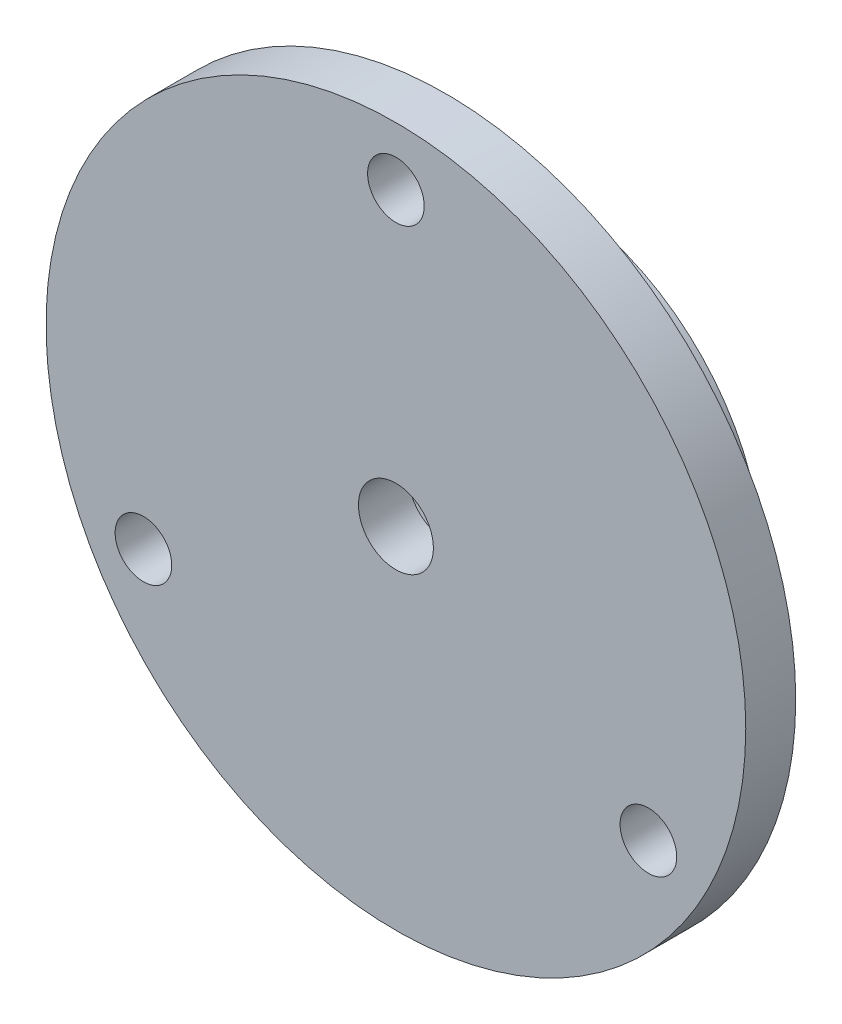
ISO-10303-21;
HEADER;
FILE_DESCRIPTION(('STEP AP214'),'2;1');
FILE_NAME('part.step','',(''),(''),'','','');
FILE_SCHEMA(('AUTOMOTIVE_DESIGN { 1 0 10303 214 1 1 1 1 }'));
ENDSEC;
DATA;
#1=APPLICATION_CONTEXT('core data for automotive mechanical design processes');
#2=APPLICATION_PROTOCOL_DEFINITION('international standard','automotive_design',2000,#1);
#3=PRODUCT_CONTEXT('',#1,'mechanical');
#4=PRODUCT('Part','Part','',(#3));
#5=PRODUCT_RELATED_PRODUCT_CATEGORY('part','',(#4));
#6=PRODUCT_DEFINITION_FORMATION('','',#4);
#7=PRODUCT_DEFINITION_CONTEXT('part definition',#1,'design');
#8=PRODUCT_DEFINITION('design','',#6,#7);
#9=PRODUCT_DEFINITION_SHAPE('','',#8);
#10=(LENGTH_UNIT() NAMED_UNIT(*) SI_UNIT(.MILLI.,.METRE.));
#11=(NAMED_UNIT(*) PLANE_ANGLE_UNIT() SI_UNIT($,.RADIAN.));
#12=(NAMED_UNIT(*) SI_UNIT($,.STERADIAN.) SOLID_ANGLE_UNIT());
#13=UNCERTAINTY_MEASURE_WITH_UNIT(LENGTH_MEASURE(1.E-05),#10,'distance_accuracy_value','');
#14=(GEOMETRIC_REPRESENTATION_CONTEXT(3) GLOBAL_UNCERTAINTY_ASSIGNED_CONTEXT((#13)) GLOBAL_UNIT_ASSIGNED_CONTEXT((#10,
#11,#12)) REPRESENTATION_CONTEXT('',''));
#15=CARTESIAN_POINT('',(0.,0.,0.));
#16=DIRECTION('',(0.,0.,1.));
#17=DIRECTION('',(1.,0.,0.));
#18=AXIS2_PLACEMENT_3D('',#15,#16,#17);
#19=CARTESIAN_POINT('',(-11.7,-3.2,124.2));
#20=DIRECTION('',(0.,0.,1.));
#21=DIRECTION('',(1.,0.,0.));
#22=AXIS2_PLACEMENT_3D('',#19,#20,#21);
#23=PLANE('',#22);
#24=DIRECTION('',(1.,0.,0.));
#25=VECTOR('',#24,1.);
#26=CARTESIAN_POINT('',(-11.7,3.2,124.2));
#27=LINE('',#26,#25);
#28=CARTESIAN_POINT('',(-11.7,3.2,124.2));
#29=VERTEX_POINT('',#28);
#30=CARTESIAN_POINT('',(-9.,3.2,124.2));
#31=VERTEX_POINT('',#30);
#32=EDGE_CURVE('E324',#29,#31,#27,.T.);
#33=ORIENTED_EDGE('',*,*,#32,.T.);
#34=DIRECTION('',(0.,1.,0.));
#35=VECTOR('',#34,1.);
#36=CARTESIAN_POINT('',(-9.,-3.2,124.2));
#37=LINE('',#36,#35);
#38=CARTESIAN_POINT('',(-9.,-3.2,124.2));
#39=VERTEX_POINT('',#38);
#40=EDGE_CURVE('E353',#39,#31,#37,.T.);
#41=ORIENTED_EDGE('',*,*,#40,.F.);
#42=DIRECTION('',(1.,0.,0.));
#43=VECTOR('',#42,1.);
#44=CARTESIAN_POINT('',(-11.7,-3.2,124.2));
#45=LINE('',#44,#43);
#46=CARTESIAN_POINT('',(-11.7,-3.2,124.2));
#47=VERTEX_POINT('',#46);
#48=EDGE_CURVE('E349',#47,#39,#45,.T.);
#49=ORIENTED_EDGE('',*,*,#48,.F.);
#50=DIRECTION('',(0.,1.,0.));
#51=VECTOR('',#50,1.);
#52=CARTESIAN_POINT('',(-11.7,-3.2,124.2));
#53=LINE('',#52,#51);
#54=EDGE_CURVE('E344',#47,#29,#53,.T.);
#55=ORIENTED_EDGE('',*,*,#54,.T.);
#56=EDGE_LOOP('',(#33,#41,#49,#55));
#57=FACE_BOUND('',#56,.T.);
#58=ADVANCED_FACE('F17',(#57),#23,.F.);
#59=CARTESIAN_POINT('',(9.,-3.2,124.2));
#60=DIRECTION('',(0.,0.,1.));
#61=DIRECTION('',(1.,0.,0.));
#62=AXIS2_PLACEMENT_3D('',#59,#60,#61);
#63=PLANE('',#62);
#64=DIRECTION('',(1.,0.,0.));
#65=VECTOR('',#64,1.);
#66=CARTESIAN_POINT('',(9.,3.2,124.2));
#67=LINE('',#66,#65);
#68=CARTESIAN_POINT('',(9.,3.2,124.2));
#69=VERTEX_POINT('',#68);
#70=CARTESIAN_POINT('',(11.7,3.2,124.2));
#71=VERTEX_POINT('',#70);
#72=EDGE_CURVE('E269',#69,#71,#67,.T.);
#73=ORIENTED_EDGE('',*,*,#72,.T.);
#74=DIRECTION('',(0.,1.,0.));
#75=VECTOR('',#74,1.);
#76=CARTESIAN_POINT('',(11.7,-3.2,124.2));
#77=LINE('',#76,#75);
#78=CARTESIAN_POINT('',(11.7,-3.2,124.2));
#79=VERTEX_POINT('',#78);
#80=EDGE_CURVE('E422',#79,#71,#77,.T.);
#81=ORIENTED_EDGE('',*,*,#80,.F.);
#82=DIRECTION('',(1.,0.,0.));
#83=VECTOR('',#82,1.);
#84=CARTESIAN_POINT('',(9.,-3.2,124.2));
#85=LINE('',#84,#83);
#86=CARTESIAN_POINT('',(9.,-3.2,124.2));
#87=VERTEX_POINT('',#86);
#88=EDGE_CURVE('E273',#87,#79,#85,.T.);
#89=ORIENTED_EDGE('',*,*,#88,.F.);
#90=DIRECTION('',(0.,1.,0.));
#91=VECTOR('',#90,1.);
#92=CARTESIAN_POINT('',(9.,-3.2,124.2));
#93=LINE('',#92,#91);
#94=EDGE_CURVE('E45',#87,#69,#93,.T.);
#95=ORIENTED_EDGE('',*,*,#94,.T.);
#96=EDGE_LOOP('',(#73,#81,#89,#95));
#97=FACE_BOUND('',#96,.T.);
#98=ADVANCED_FACE('F677',(#97),#63,.F.);
#99=CARTESIAN_POINT('',(0.,0.,121.));
#100=DIRECTION('',(-1.,0.,0.));
#101=DIRECTION('',(0.,0.,-1.));
#102=AXIS2_PLACEMENT_3D('',#99,#100,#101);
#103=CYLINDRICAL_SURFACE('',#102,1.7);
#104=DIRECTION('',(-1.,0.,0.));
#105=VECTOR('',#104,1.);
#106=CARTESIAN_POINT('',(0.,0.,119.3));
#107=LINE('',#106,#105);
#108=CARTESIAN_POINT('',(-8.2,0.,119.3));
#109=VERTEX_POINT('',#108);
#110=CARTESIAN_POINT('',(-9.,0.,119.3));
#111=VERTEX_POINT('',#110);
#112=EDGE_CURVE('E11',#109,#111,#107,.T.);
#113=ORIENTED_EDGE('',*,*,#112,.F.);
#114=CARTESIAN_POINT('',(-8.2,0.,119.3));
#115=CARTESIAN_POINT('',(-8.2,-0.215049567675,119.3));
#116=CARTESIAN_POINT('',(-8.19342000577,-0.425159052088,119.33173741756));
#117=CARTESIAN_POINT('',(-8.180805876149,-0.624765249664,119.39258934721));
#118=CARTESIAN_POINT('',(-8.163664813006,-0.809082687118,119.47882243838));
#119=CARTESIAN_POINT('',(-8.144154972524,-0.974297761011,119.58561731685));
#120=CARTESIAN_POINT('',(-8.124365167369,-1.11792391323,119.70707430979));
#121=CARTESIAN_POINT('',(-8.085287226445,-1.37352971205,119.97926683929));
#122=CARTESIAN_POINT('',(-8.065762470475,-1.483866681464,120.13534020304));
#123=CARTESIAN_POINT('',(-8.04881135232,-1.570967112417,120.30039462866));
#124=CARTESIAN_POINT('',(-8.035484881398,-1.635638451659,120.47149151375));
#125=CARTESIAN_POINT('',(-8.026395702797,-1.678527139966,120.64635953353));
#126=CARTESIAN_POINT('',(-8.021845174273,-1.7,120.82311151406));
#127=CARTESIAN_POINT('',(-8.021845174273,-1.7,121.17689689779));
#128=CARTESIAN_POINT('',(-8.026396123594,-1.678525133985,121.35364759402));
#129=CARTESIAN_POINT('',(-8.035485309028,-1.635636489501,121.52851080296));
#130=CARTESIAN_POINT('',(-8.048811262946,-1.570967120081,121.69960390039));
#131=CARTESIAN_POINT('',(-8.065762205321,-1.483868247767,121.86465770356));
#132=CARTESIAN_POINT('',(-8.085287123111,-1.373530387951,122.02073244094));
#133=CARTESIAN_POINT('',(-8.12435821755,-1.117969371457,122.29287728211));
#134=CARTESIAN_POINT('',(-8.144149665467,-0.974343035678,122.41435808913));
#135=CARTESIAN_POINT('',(-8.163666864111,-0.809085513769,122.52119388815));
#136=CARTESIAN_POINT('',(-8.180813840138,-0.624705210107,122.60744918929));
#137=CARTESIAN_POINT('',(-8.193425987174,-0.425051885172,122.66829135448));
#138=CARTESIAN_POINT('',(-8.2,-0.214951988363,122.7));
#139=CARTESIAN_POINT('',(-8.2,0.215049567675,122.7));
#140=CARTESIAN_POINT('',(-8.19342000577,0.425159052088,122.66826258243));
#141=CARTESIAN_POINT('',(-8.180805876149,0.624765249663,122.60741065278));
#142=CARTESIAN_POINT('',(-8.163664813006,0.809082687119,122.52117756161));
#143=CARTESIAN_POINT('',(-8.144154972524,0.974297761011,122.41438268314));
#144=CARTESIAN_POINT('',(-8.124365167369,1.11792391323,122.2929256902));
#145=CARTESIAN_POINT('',(-8.085287123814,1.373530383354,122.02073244583));
#146=CARTESIAN_POINT('',(-8.065762203446,1.483868259853,121.86465769266));
#147=CARTESIAN_POINT('',(-8.048811265008,1.570967106626,121.69960390501));
#148=CARTESIAN_POINT('',(-8.03548530799,1.635636496646,121.52851081345));
#149=CARTESIAN_POINT('',(-8.026396123783,1.678525132483,121.35364757984));
#150=CARTESIAN_POINT('',(-8.021845174273,1.7,121.17689690355));
#151=CARTESIAN_POINT('',(-8.021845174273,1.7,120.8231031022));
#152=CARTESIAN_POINT('',(-8.026396123594,1.678525133985,120.64635240597));
#153=CARTESIAN_POINT('',(-8.035485309028,1.635636489502,120.47148919703));
#154=CARTESIAN_POINT('',(-8.048811262946,1.57096712008,120.3003960996));
#155=CARTESIAN_POINT('',(-8.065762205321,1.483868247767,120.13534229643));
#156=CARTESIAN_POINT('',(-8.085287123111,1.373530387951,119.97926755905));
#157=CARTESIAN_POINT('',(-8.124358951378,1.117964571544,119.7071176065));
#158=CARTESIAN_POINT('',(-8.144150850697,0.974334202841,119.58563499163));
#159=CARTESIAN_POINT('',(-8.163667653587,0.809076841195,119.4788027514));
#160=CARTESIAN_POINT('',(-8.180813546129,0.624702938803,119.39255245146));
#161=CARTESIAN_POINT('',(-8.193425309427,0.425058662931,119.33171181383));
#162=CARTESIAN_POINT('',(-8.2,0.214962826234,119.3));
#163=CARTESIAN_POINT('',(-8.2,0.,119.3));
#164=(BOUNDED_CURVE() B_SPLINE_CURVE(7,(#114,#115,#116,#117,#118,#119,#120,#121,#122,#123,#124,
#125,#126,#127,#128,#129,#130,#131,#132,#133,#134,#135,#136,#137,#138,#139,#140,#141,#142,#143,
#144,#145,#146,#147,#148,#149,#150,#151,#152,#153,#154,#155,#156,#157,#158,#159,#160,#161,#162,
#163),.UNSPECIFIED.,.T.,.F.) B_SPLINE_CURVE_WITH_KNOTS((8,6,6,6,6,6,6,6,8),(0.,0.118663257912,
0.25000270751,0.381348402899,0.499972242849,0.618649933116,0.750006013472,0.881362089547,1.),
.UNSPECIFIED.) CURVE() GEOMETRIC_REPRESENTATION_ITEM() RATIONAL_B_SPLINE_CURVE((1.,1.,1.,1.,1.,
1.,1.,1.,1.,1.,1.,1.,1.,1.,1.,1.,1.,1.,1.,1.,1.,1.,1.,1.,1.,1.,1.,1.,1.,1.,1.,1.,1.,1.,1.,1.,1.,
1.,1.,1.,1.,1.,1.,1.,1.,1.,1.,1.,1.,1.)) REPRESENTATION_ITEM(''));
#165=EDGE_CURVE('E410',#109,#109,#164,.T.);
#166=ORIENTED_EDGE('',*,*,#165,.F.);
#167=ORIENTED_EDGE('',*,*,#112,.T.);
#168=CARTESIAN_POINT('',(-9.,0.,121.));
#169=DIRECTION('',(-1.,0.,0.));
#170=DIRECTION('',(0.,0.,-1.));
#171=AXIS2_PLACEMENT_3D('',#168,#169,#170);
#172=CIRCLE('',#171,1.7);
#173=EDGE_CURVE('E365',#111,#111,#172,.T.);
#174=ORIENTED_EDGE('',*,*,#173,.T.);
#175=EDGE_LOOP('',(#113,#166,#167,#174));
#176=FACE_BOUND('',#175,.T.);
#177=ADVANCED_FACE('F668',(#176),#103,.F.);
#178=CARTESIAN_POINT('',(0.,0.,121.));
#179=DIRECTION('',(1.,0.,0.));
#180=DIRECTION('',(0.,0.,1.));
#181=AXIS2_PLACEMENT_3D('',#178,#179,#180);
#182=CYLINDRICAL_SURFACE('',#181,1.7);
#183=DIRECTION('',(1.,0.,0.));
#184=VECTOR('',#183,1.);
#185=CARTESIAN_POINT('',(0.,0.,122.7));
#186=LINE('',#185,#184);
#187=CARTESIAN_POINT('',(8.2,0.,122.7));
#188=VERTEX_POINT('',#187);
#189=CARTESIAN_POINT('',(9.,0.,122.7));
#190=VERTEX_POINT('',#189);
#191=EDGE_CURVE('E25',#188,#190,#186,.T.);
#192=ORIENTED_EDGE('',*,*,#191,.F.);
#193=CARTESIAN_POINT('',(8.2,0.,119.3));
#194=CARTESIAN_POINT('',(8.2,0.215049567675,119.3));
#195=CARTESIAN_POINT('',(8.19342000577,0.425159052088,119.33173741756));
#196=CARTESIAN_POINT('',(8.180805876149,0.624765249664,119.39258934721));
#197=CARTESIAN_POINT('',(8.163664813006,0.809082687119,119.47882243838));
#198=CARTESIAN_POINT('',(8.144154972524,0.974297761011,119.58561731685));
#199=CARTESIAN_POINT('',(8.124365167369,1.11792391323,119.70707430979));
#200=CARTESIAN_POINT('',(8.085287123111,1.373530387951,119.97926755905));
#201=CARTESIAN_POINT('',(8.065762205321,1.483868247767,120.13534229643));
#202=CARTESIAN_POINT('',(8.048811262946,1.570967120081,120.3003960996));
#203=CARTESIAN_POINT('',(8.035485309028,1.635636489501,120.47148919703));
#204=CARTESIAN_POINT('',(8.026396123594,1.678525133985,120.64635240597));
#205=CARTESIAN_POINT('',(8.021845174273,1.7,120.8231031022));
#206=CARTESIAN_POINT('',(8.021845174273,1.7,121.17689689779));
#207=CARTESIAN_POINT('',(8.026396123594,1.678525133985,121.35364759402));
#208=CARTESIAN_POINT('',(8.035485309028,1.635636489501,121.52851080296));
#209=CARTESIAN_POINT('',(8.048811262946,1.570967120081,121.69960390039));
#210=CARTESIAN_POINT('',(8.065762205321,1.483868247766,121.86465770356));
#211=CARTESIAN_POINT('',(8.085287123111,1.373530387951,122.02073244094));
#212=CARTESIAN_POINT('',(8.124358951378,1.117964571544,122.29288239349));
#213=CARTESIAN_POINT('',(8.144150850697,0.974334202841,122.41436500836));
#214=CARTESIAN_POINT('',(8.163667653587,0.809076841196,122.52119724859));
#215=CARTESIAN_POINT('',(8.180813546129,0.624702938803,122.60744754853));
#216=CARTESIAN_POINT('',(8.193425309427,0.425058662931,122.66828818616));
#217=CARTESIAN_POINT('',(8.2,0.214962826234,122.7));
#218=CARTESIAN_POINT('',(8.2,0.,122.7));
#219=(BOUNDED_CURVE() B_SPLINE_CURVE(7,(#193,#194,#195,#196,#197,#198,#199,#200,#201,#202,#203,
#204,#205,#206,#207,#208,#209,#210,#211,#212,#213,#214,#215,#216,#217,#218),.UNSPECIFIED.,.F.,
.F.) B_SPLINE_CURVE_WITH_KNOTS((8,6,6,6,8),(0.,0.237342194584,0.500039769677,0.762737344771,1.),
.UNSPECIFIED.) CURVE() GEOMETRIC_REPRESENTATION_ITEM() RATIONAL_B_SPLINE_CURVE((1.,1.,1.,1.,1.,
1.,1.,1.,1.,1.,1.,1.,1.,1.,1.,1.,1.,1.,1.,1.,1.,1.,1.,1.,1.,1.)) REPRESENTATION_ITEM(''));
#220=CARTESIAN_POINT('',(8.2,0.,119.3));
#221=VERTEX_POINT('',#220);
#222=EDGE_CURVE('E390',#221,#188,#219,.T.);
#223=ORIENTED_EDGE('',*,*,#222,.F.);
#224=CARTESIAN_POINT('',(8.2,0.,122.7));
#225=CARTESIAN_POINT('',(8.2,-0.215049567675,122.7));
#226=CARTESIAN_POINT('',(8.19342000577,-0.425159052088,122.66826258243));
#227=CARTESIAN_POINT('',(8.180805876149,-0.624765249663,122.60741065278));
#228=CARTESIAN_POINT('',(8.163664813006,-0.809082687119,122.52117756161));
#229=CARTESIAN_POINT('',(8.144154972524,-0.974297761011,122.41438268314));
#230=CARTESIAN_POINT('',(8.124365167369,-1.117923913229,122.2929256902));
#231=CARTESIAN_POINT('',(8.085287226445,-1.37352971205,122.0207331607));
#232=CARTESIAN_POINT('',(8.065762470475,-1.483866681464,121.86465979695));
#233=CARTESIAN_POINT('',(8.04881135232,-1.570967112417,121.69960537133));
#234=CARTESIAN_POINT('',(8.035484881398,-1.635638451659,121.52850848624));
#235=CARTESIAN_POINT('',(8.026395702797,-1.678527139966,121.35364046646));
#236=CARTESIAN_POINT('',(8.021845174273,-1.7,121.17688848593));
#237=CARTESIAN_POINT('',(8.021845174273,-1.7,120.8231031022));
#238=CARTESIAN_POINT('',(8.026396123594,-1.678525133985,120.64635240597));
#239=CARTESIAN_POINT('',(8.035485309028,-1.635636489501,120.47148919703));
#240=CARTESIAN_POINT('',(8.048811262946,-1.570967120081,120.3003960996));
#241=CARTESIAN_POINT('',(8.065762205321,-1.483868247766,120.13534229643));
#242=CARTESIAN_POINT('',(8.085287123111,-1.373530387951,119.97926755905));
#243=CARTESIAN_POINT('',(8.12435821755,-1.117969371457,119.70712271789));
#244=CARTESIAN_POINT('',(8.144149665467,-0.974343035678,119.58564191086));
#245=CARTESIAN_POINT('',(8.163666864111,-0.809085513768,119.47880611184));
#246=CARTESIAN_POINT('',(8.180813840138,-0.624705210107,119.3925508107));
#247=CARTESIAN_POINT('',(8.193425987174,-0.425051885172,119.33170864551));
#248=CARTESIAN_POINT('',(8.2,-0.214951988363,119.3));
#249=CARTESIAN_POINT('',(8.2,0.,119.3));
#250=(BOUNDED_CURVE() B_SPLINE_CURVE(7,(#224,#225,#226,#227,#228,#229,#230,#231,#232,#233,#234,
#235,#236,#237,#238,#239,#240,#241,#242,#243,#244,#245,#246,#247,#248,#249),.UNSPECIFIED.,.F.,
.F.) B_SPLINE_CURVE_WITH_KNOTS((8,6,6,6,8),(0.,0.237339691572,0.500033174013,0.762739148729,1.),
.UNSPECIFIED.) CURVE() GEOMETRIC_REPRESENTATION_ITEM() RATIONAL_B_SPLINE_CURVE((1.,1.,1.,1.,1.,
1.,1.,1.,1.,1.,1.,1.,1.,1.,1.,1.,1.,1.,1.,1.,1.,1.,1.,1.,1.,1.)) REPRESENTATION_ITEM(''));
#251=EDGE_CURVE('E405',#188,#221,#250,.T.);
#252=ORIENTED_EDGE('',*,*,#251,.F.);
#253=ORIENTED_EDGE('',*,*,#191,.T.);
#254=CARTESIAN_POINT('',(9.,0.,121.));
#255=DIRECTION('',(1.,0.,0.));
#256=DIRECTION('',(0.,0.,1.));
#257=AXIS2_PLACEMENT_3D('',#254,#255,#256);
#258=CIRCLE('',#257,1.7);
#259=EDGE_CURVE('E252',#190,#190,#258,.T.);
#260=ORIENTED_EDGE('',*,*,#259,.T.);
#261=EDGE_LOOP('',(#192,#223,#252,#253,#260));
#262=FACE_BOUND('',#261,.T.);
#263=ADVANCED_FACE('F658',(#262),#182,.F.);
#264=CARTESIAN_POINT('',(9.,-3.2,117.9));
#265=DIRECTION('',(1.,0.,0.));
#266=DIRECTION('',(0.,1.,0.));
#267=AXIS2_PLACEMENT_3D('',#264,#265,#266);
#268=PLANE('',#267);
#269=ORIENTED_EDGE('',*,*,#259,.F.);
#270=EDGE_LOOP('',(#269));
#271=FACE_BOUND('',#270,.T.);
#272=DIRECTION('',(0.,0.,1.));
#273=VECTOR('',#272,1.);
#274=CARTESIAN_POINT('',(9.,-3.2,117.9));
#275=LINE('',#274,#273);
#276=CARTESIAN_POINT('',(9.,-3.2,118.));
#277=VERTEX_POINT('',#276);
#278=EDGE_CURVE('E292',#277,#87,#275,.T.);
#279=ORIENTED_EDGE('',*,*,#278,.F.);
#280=DIRECTION('',(0.,1.,0.));
#281=VECTOR('',#280,1.);
#282=CARTESIAN_POINT('',(9.,-1.6,118.));
#283=LINE('',#282,#281);
#284=CARTESIAN_POINT('',(9.,3.2,118.));
#285=VERTEX_POINT('',#284);
#286=EDGE_CURVE('E364',#277,#285,#283,.T.);
#287=ORIENTED_EDGE('',*,*,#286,.T.);
#288=DIRECTION('',(0.,0.,1.));
#289=VECTOR('',#288,1.);
#290=CARTESIAN_POINT('',(9.,3.2,117.9));
#291=LINE('',#290,#289);
#292=EDGE_CURVE('E272',#285,#69,#291,.T.);
#293=ORIENTED_EDGE('',*,*,#292,.T.);
#294=ORIENTED_EDGE('',*,*,#94,.F.);
#295=EDGE_LOOP('',(#279,#287,#293,#294));
#296=FACE_BOUND('',#295,.T.);
#297=ADVANCED_FACE('F648',(#271,#296),#268,.T.);
#298=CARTESIAN_POINT('',(9.,3.2,117.9));
#299=DIRECTION('',(0.,1.,0.));
#300=DIRECTION('',(1.,0.,0.));
#301=AXIS2_PLACEMENT_3D('',#298,#299,#300);
#302=PLANE('',#301);
#303=ORIENTED_EDGE('',*,*,#72,.F.);
#304=ORIENTED_EDGE('',*,*,#292,.F.);
#305=DIRECTION('',(-1.,0.,0.));
#306=VECTOR('',#305,1.);
#307=CARTESIAN_POINT('',(4.5,3.2,118.));
#308=LINE('',#307,#306);
#309=CARTESIAN_POINT('',(11.7,3.2,118.));
#310=VERTEX_POINT('',#309);
#311=EDGE_CURVE('E259',#310,#285,#308,.T.);
#312=ORIENTED_EDGE('',*,*,#311,.F.);
#313=DIRECTION('',(0.,0.,1.));
#314=VECTOR('',#313,1.);
#315=CARTESIAN_POINT('',(11.7,3.2,117.9));
#316=LINE('',#315,#314);
#317=EDGE_CURVE('E429',#310,#71,#316,.T.);
#318=ORIENTED_EDGE('',*,*,#317,.T.);
#319=EDGE_LOOP('',(#303,#304,#312,#318));
#320=FACE_BOUND('',#319,.T.);
#321=ADVANCED_FACE('F489',(#320),#302,.F.);
#322=CARTESIAN_POINT('',(9.,-3.2,117.9));
#323=DIRECTION('',(0.,1.,0.));
#324=DIRECTION('',(1.,0.,0.));
#325=AXIS2_PLACEMENT_3D('',#322,#323,#324);
#326=PLANE('',#325);
#327=DIRECTION('',(0.,0.,1.));
#328=VECTOR('',#327,1.);
#329=CARTESIAN_POINT('',(11.7,-3.2,117.9));
#330=LINE('',#329,#328);
#331=CARTESIAN_POINT('',(11.7,-3.2,118.));
#332=VERTEX_POINT('',#331);
#333=EDGE_CURVE('E433',#332,#79,#330,.T.);
#334=ORIENTED_EDGE('',*,*,#333,.F.);
#335=DIRECTION('',(-1.,0.,0.));
#336=VECTOR('',#335,1.);
#337=CARTESIAN_POINT('',(4.5,-3.2,118.));
#338=LINE('',#337,#336);
#339=EDGE_CURVE('E373',#332,#277,#338,.T.);
#340=ORIENTED_EDGE('',*,*,#339,.T.);
#341=ORIENTED_EDGE('',*,*,#278,.T.);
#342=ORIENTED_EDGE('',*,*,#88,.T.);
#343=EDGE_LOOP('',(#334,#340,#341,#342));
#344=FACE_BOUND('',#343,.T.);
#345=ADVANCED_FACE('F483',(#344),#326,.T.);
#346=CARTESIAN_POINT('',(-11.7,3.2,117.9));
#347=DIRECTION('',(0.,1.,0.));
#348=DIRECTION('',(1.,0.,0.));
#349=AXIS2_PLACEMENT_3D('',#346,#347,#348);
#350=PLANE('',#349);
#351=ORIENTED_EDGE('',*,*,#32,.F.);
#352=DIRECTION('',(0.,0.,1.));
#353=VECTOR('',#352,1.);
#354=CARTESIAN_POINT('',(-11.7,3.2,117.9));
#355=LINE('',#354,#353);
#356=CARTESIAN_POINT('',(-11.7,3.2,118.));
#357=VERTEX_POINT('',#356);
#358=EDGE_CURVE('E348',#357,#29,#355,.T.);
#359=ORIENTED_EDGE('',*,*,#358,.F.);
#360=DIRECTION('',(-1.,0.,0.));
#361=VECTOR('',#360,1.);
#362=CARTESIAN_POINT('',(-5.85,3.2,118.));
#363=LINE('',#362,#361);
#364=CARTESIAN_POINT('',(-9.,3.2,118.));
#365=VERTEX_POINT('',#364);
#366=EDGE_CURVE('E335',#365,#357,#363,.T.);
#367=ORIENTED_EDGE('',*,*,#366,.F.);
#368=DIRECTION('',(0.,0.,1.));
#369=VECTOR('',#368,1.);
#370=CARTESIAN_POINT('',(-9.,3.2,117.9));
#371=LINE('',#370,#369);
#372=EDGE_CURVE('E369',#365,#31,#371,.T.);
#373=ORIENTED_EDGE('',*,*,#372,.T.);
#374=EDGE_LOOP('',(#351,#359,#367,#373));
#375=FACE_BOUND('',#374,.T.);
#376=ADVANCED_FACE('F488',(#375),#350,.F.);
#377=CARTESIAN_POINT('',(-11.7,-3.2,117.9));
#378=DIRECTION('',(1.,0.,0.));
#379=DIRECTION('',(0.,1.,0.));
#380=AXIS2_PLACEMENT_3D('',#377,#378,#379);
#381=PLANE('',#380);
#382=CARTESIAN_POINT('',(-11.7,0.,121.));
#383=DIRECTION('',(-1.,0.,0.));
#384=DIRECTION('',(0.,0.,-1.));
#385=AXIS2_PLACEMENT_3D('',#382,#383,#384);
#386=CIRCLE('',#385,1.7);
#387=CARTESIAN_POINT('',(-11.7,0.,119.3));
#388=VERTEX_POINT('',#387);
#389=EDGE_CURVE('E377',#388,#388,#386,.T.);
#390=ORIENTED_EDGE('',*,*,#389,.T.);
#391=EDGE_LOOP('',(#390));
#392=FACE_BOUND('',#391,.T.);
#393=DIRECTION('',(0.,0.,1.));
#394=VECTOR('',#393,1.);
#395=CARTESIAN_POINT('',(-11.7,-3.2,117.9));
#396=LINE('',#395,#394);
#397=CARTESIAN_POINT('',(-11.7,-3.2,118.));
#398=VERTEX_POINT('',#397);
#399=EDGE_CURVE('E354',#398,#47,#396,.T.);
#400=ORIENTED_EDGE('',*,*,#399,.F.);
#401=DIRECTION('',(0.,1.,0.));
#402=VECTOR('',#401,1.);
#403=CARTESIAN_POINT('',(-11.7,-1.6,118.));
#404=LINE('',#403,#402);
#405=EDGE_CURVE('E339',#398,#357,#404,.T.);
#406=ORIENTED_EDGE('',*,*,#405,.T.);
#407=ORIENTED_EDGE('',*,*,#358,.T.);
#408=ORIENTED_EDGE('',*,*,#54,.F.);
#409=EDGE_LOOP('',(#400,#406,#407,#408));
#410=FACE_BOUND('',#409,.T.);
#411=ADVANCED_FACE('F622',(#392,#410),#381,.T.);
#412=CARTESIAN_POINT('',(-9.,-3.2,117.9));
#413=DIRECTION('',(1.,0.,0.));
#414=DIRECTION('',(0.,1.,0.));
#415=AXIS2_PLACEMENT_3D('',#412,#413,#414);
#416=PLANE('',#415);
#417=ORIENTED_EDGE('',*,*,#173,.F.);
#418=EDGE_LOOP('',(#417));
#419=FACE_BOUND('',#418,.T.);
#420=ORIENTED_EDGE('',*,*,#40,.T.);
#421=ORIENTED_EDGE('',*,*,#372,.F.);
#422=DIRECTION('',(0.,1.,0.));
#423=VECTOR('',#422,1.);
#424=CARTESIAN_POINT('',(-9.,-1.6,118.));
#425=LINE('',#424,#423);
#426=CARTESIAN_POINT('',(-9.,-3.2,118.));
#427=VERTEX_POINT('',#426);
#428=EDGE_CURVE('E331',#427,#365,#425,.T.);
#429=ORIENTED_EDGE('',*,*,#428,.F.);
#430=DIRECTION('',(0.,0.,1.));
#431=VECTOR('',#430,1.);
#432=CARTESIAN_POINT('',(-9.,-3.2,117.9));
#433=LINE('',#432,#431);
#434=EDGE_CURVE('E437',#427,#39,#433,.T.);
#435=ORIENTED_EDGE('',*,*,#434,.T.);
#436=EDGE_LOOP('',(#420,#421,#429,#435));
#437=FACE_BOUND('',#436,.T.);
#438=ADVANCED_FACE('F519',(#419,#437),#416,.F.);
#439=CARTESIAN_POINT('',(-11.7,-3.2,117.9));
#440=DIRECTION('',(0.,1.,0.));
#441=DIRECTION('',(1.,0.,0.));
#442=AXIS2_PLACEMENT_3D('',#439,#440,#441);
#443=PLANE('',#442);
#444=ORIENTED_EDGE('',*,*,#434,.F.);
#445=DIRECTION('',(-1.,0.,0.));
#446=VECTOR('',#445,1.);
#447=CARTESIAN_POINT('',(-5.85,-3.2,118.));
#448=LINE('',#447,#446);
#449=EDGE_CURVE('E343',#427,#398,#448,.T.);
#450=ORIENTED_EDGE('',*,*,#449,.T.);
#451=ORIENTED_EDGE('',*,*,#399,.T.);
#452=ORIENTED_EDGE('',*,*,#48,.T.);
#453=EDGE_LOOP('',(#444,#450,#451,#452));
#454=FACE_BOUND('',#453,.T.);
#455=ADVANCED_FACE('F513',(#454),#443,.T.);
#456=CARTESIAN_POINT('',(11.7,-3.2,117.9));
#457=DIRECTION('',(1.,0.,0.));
#458=DIRECTION('',(0.,1.,0.));
#459=AXIS2_PLACEMENT_3D('',#456,#457,#458);
#460=PLANE('',#459);
#461=CARTESIAN_POINT('',(11.7,0.,121.));
#462=DIRECTION('',(1.,0.,0.));
#463=DIRECTION('',(0.,0.,1.));
#464=AXIS2_PLACEMENT_3D('',#461,#462,#463);
#465=CIRCLE('',#464,1.7);
#466=CARTESIAN_POINT('',(11.7,0.,122.7));
#467=VERTEX_POINT('',#466);
#468=EDGE_CURVE('E320',#467,#467,#465,.T.);
#469=ORIENTED_EDGE('',*,*,#468,.T.);
#470=EDGE_LOOP('',(#469));
#471=FACE_BOUND('',#470,.T.);
#472=ORIENTED_EDGE('',*,*,#80,.T.);
#473=ORIENTED_EDGE('',*,*,#317,.F.);
#474=DIRECTION('',(0.,1.,0.));
#475=VECTOR('',#474,1.);
#476=CARTESIAN_POINT('',(11.7,-1.6,118.));
#477=LINE('',#476,#475);
#478=EDGE_CURVE('E255',#332,#310,#477,.T.);
#479=ORIENTED_EDGE('',*,*,#478,.F.);
#480=ORIENTED_EDGE('',*,*,#333,.T.);
#481=EDGE_LOOP('',(#472,#473,#479,#480));
#482=FACE_BOUND('',#481,.T.);
#483=ADVANCED_FACE('F518',(#471,#482),#460,.F.);
#484=CARTESIAN_POINT('',(0.,0.,118.));
#485=DIRECTION('',(0.,0.,1.));
#486=DIRECTION('',(1.,0.,0.));
#487=AXIS2_PLACEMENT_3D('',#484,#485,#486);
#488=CYLINDRICAL_SURFACE('',#487,8.2);
#489=ORIENTED_EDGE('',*,*,#165,.T.);
#490=EDGE_LOOP('',(#489));
#491=FACE_BOUND('',#490,.T.);
#492=DIRECTION('',(0.,0.,1.));
#493=VECTOR('',#492,1.);
#494=CARTESIAN_POINT('',(8.2,0.,118.));
#495=LINE('',#494,#493);
#496=CARTESIAN_POINT('',(8.2,0.,118.));
#497=VERTEX_POINT('',#496);
#498=EDGE_CURVE('E386',#497,#221,#495,.T.);
#499=ORIENTED_EDGE('',*,*,#498,.F.);
#500=CARTESIAN_POINT('',(0.,0.,118.));
#501=DIRECTION('',(0.,0.,1.));
#502=DIRECTION('',(1.,0.,0.));
#503=AXIS2_PLACEMENT_3D('',#500,#501,#502);
#504=CIRCLE('',#503,8.2);
#505=EDGE_CURVE('E260',#497,#497,#504,.T.);
#506=ORIENTED_EDGE('',*,*,#505,.F.);
#507=ORIENTED_EDGE('',*,*,#498,.T.);
#508=ORIENTED_EDGE('',*,*,#222,.T.);
#509=DIRECTION('',(0.,0.,1.));
#510=VECTOR('',#509,1.);
#511=CARTESIAN_POINT('',(8.2,0.,118.));
#512=LINE('',#511,#510);
#513=CARTESIAN_POINT('',(8.2,0.,124.));
#514=VERTEX_POINT('',#513);
#515=EDGE_CURVE('E396',#188,#514,#512,.T.);
#516=ORIENTED_EDGE('',*,*,#515,.T.);
#517=CARTESIAN_POINT('',(0.,0.,124.));
#518=DIRECTION('',(0.,0.,1.));
#519=DIRECTION('',(1.,0.,0.));
#520=AXIS2_PLACEMENT_3D('',#517,#518,#519);
#521=CIRCLE('',#520,8.2);
#522=EDGE_CURVE('E313',#514,#514,#521,.T.);
#523=ORIENTED_EDGE('',*,*,#522,.T.);
#524=ORIENTED_EDGE('',*,*,#515,.F.);
#525=ORIENTED_EDGE('',*,*,#251,.T.);
#526=EDGE_LOOP('',(#499,#506,#507,#508,#516,#523,#524,#525));
#527=FACE_BOUND('',#526,.T.);
#528=ADVANCED_FACE('F557',(#491,#527),#488,.F.);
#529=CARTESIAN_POINT('',(0.,0.,121.));
#530=DIRECTION('',(-1.,0.,0.));
#531=DIRECTION('',(0.,0.,-1.));
#532=AXIS2_PLACEMENT_3D('',#529,#530,#531);
#533=CYLINDRICAL_SURFACE('',#532,1.7);
#534=ORIENTED_EDGE('',*,*,#389,.F.);
#535=DIRECTION('',(-1.,0.,0.));
#536=VECTOR('',#535,1.);
#537=CARTESIAN_POINT('',(0.,0.,119.3));
#538=LINE('',#537,#536);
#539=CARTESIAN_POINT('',(-13.,0.,119.3));
#540=VERTEX_POINT('',#539);
#541=EDGE_CURVE('E383',#388,#540,#538,.T.);
#542=ORIENTED_EDGE('',*,*,#541,.T.);
#543=CARTESIAN_POINT('',(-13.,0.,119.3));
#544=CARTESIAN_POINT('',(-13.,-0.224103629449,119.3));
#545=CARTESIAN_POINT('',(-12.99549275468,-0.442789022544,119.33446610057));
#546=CARTESIAN_POINT('',(-12.98687134126,-0.649799316419,119.40040035514));
#547=CARTESIAN_POINT('',(-12.97525605399,-0.839828402853,119.49353374006));
#548=CARTESIAN_POINT('',(-12.96223136851,-1.008753052545,119.60838750048));
#549=CARTESIAN_POINT('',(-12.94924809956,-1.154034109881,119.73834678735));
#550=CARTESIAN_POINT('',(-12.92508396124,-1.399189065451,120.01642050051));
#551=CARTESIAN_POINT('',(-12.91365232029,-1.500963221601,120.16834585257));
#552=CARTESIAN_POINT('',(-12.90383838395,-1.58123194231,120.32799584137));
#553=CARTESIAN_POINT('',(-12.89617808196,-1.640780500266,120.49279987346));
#554=CARTESIAN_POINT('',(-12.89097228887,-1.68024700538,120.66078608316));
#555=CARTESIAN_POINT('',(-12.88836684766,-1.7,120.83034346275));
#556=CARTESIAN_POINT('',(-12.88836684766,-1.7,121.16966285561));
#557=CARTESIAN_POINT('',(-12.890972477,-1.680245562312,121.33921887524));
#558=CARTESIAN_POINT('',(-12.89617825391,-1.640779241953,121.50720074066));
#559=CARTESIAN_POINT('',(-12.90383826114,-1.581232598169,121.6720009562));
#560=CARTESIAN_POINT('',(-12.91365201798,-1.500965777864,121.83164988873));
#561=CARTESIAN_POINT('',(-12.9250837383,-1.399191327267,121.98357693395));
#562=CARTESIAN_POINT('',(-12.94924333682,-1.15408242977,122.26159840449));
#563=CARTESIAN_POINT('',(-12.96222755883,-1.008802489091,122.3915842386));
#564=CARTESIAN_POINT('',(-12.97525737315,-0.83983232772,122.50648469976));
#565=CARTESIAN_POINT('',(-12.98687712171,-0.649733825668,122.59964393151));
#566=CARTESIAN_POINT('',(-12.99549711041,-0.442670474442,122.66556715007));
#567=CARTESIAN_POINT('',(-13.,-0.223995428021,122.7));
#568=CARTESIAN_POINT('',(-13.,0.224103629449,122.7));
#569=CARTESIAN_POINT('',(-12.99549275468,0.442789022544,122.66553389942));
#570=CARTESIAN_POINT('',(-12.98687134126,0.64979931642,122.59959964485));
#571=CARTESIAN_POINT('',(-12.97525605399,0.839828402852,122.50646625993));
#572=CARTESIAN_POINT('',(-12.96223136851,1.008753052545,122.39161249951));
#573=CARTESIAN_POINT('',(-12.94924809956,1.154034109881,122.26165321264));
#574=CARTESIAN_POINT('',(-12.9250837383,1.399191327267,121.98357693395));
#575=CARTESIAN_POINT('',(-12.91365201798,1.500965777864,121.83164988873));
#576=CARTESIAN_POINT('',(-12.90383826114,1.58123259817,121.6720009562));
#577=CARTESIAN_POINT('',(-12.89617825391,1.640779241953,121.50720074067));
#578=CARTESIAN_POINT('',(-12.890972477,1.680245562312,121.33921887524));
#579=CARTESIAN_POINT('',(-12.88836684766,1.7,121.16966285561));
#580=CARTESIAN_POINT('',(-12.88836684766,1.7,120.83033714438));
#581=CARTESIAN_POINT('',(-12.890972477,1.680245562312,120.66078112475));
#582=CARTESIAN_POINT('',(-12.89617825391,1.640779241953,120.49279925933));
#583=CARTESIAN_POINT('',(-12.90383826114,1.58123259817,120.32799904379));
#584=CARTESIAN_POINT('',(-12.91365201798,1.500965777864,120.16835011126));
#585=CARTESIAN_POINT('',(-12.9250837383,1.399191327267,120.01642306604));
#586=CARTESIAN_POINT('',(-12.94924381395,1.154077589096,119.73839610484));
#587=CARTESIAN_POINT('',(-12.96222832865,1.008793604947,119.60840846593));
#588=CARTESIAN_POINT('',(-12.97525787918,0.839823888834,119.49351212929));
#589=CARTESIAN_POINT('',(-12.98687682519,0.649732618766,119.4003585362));
#590=CARTESIAN_POINT('',(-12.99549658253,0.442679411078,119.33443680822));
#591=CARTESIAN_POINT('',(-13.,0.224008392086,119.3));
#592=CARTESIAN_POINT('',(-13.,0.,119.3));
#593=(BOUNDED_CURVE() B_SPLINE_CURVE(7,(#543,#544,#545,#546,#547,#548,#549,#550,#551,#552,#553,
#554,#555,#556,#557,#558,#559,#560,#561,#562,#563,#564,#565,#566,#567,#568,#569,#570,#571,#572,
#573,#574,#575,#576,#577,#578,#579,#580,#581,#582,#583,#584,#585,#586,#587,#588,#589,#590,#591,
#592),.UNSPECIFIED.,.T.,.F.) B_SPLINE_CURVE_WITH_KNOTS((8,6,6,6,6,6,6,6,8),(0.,0.123552872121,
0.250007608065,0.376467053447,0.499972995958,0.623538598255,0.750008670189,0.876478742124,1.),
.UNSPECIFIED.) CURVE() GEOMETRIC_REPRESENTATION_ITEM() RATIONAL_B_SPLINE_CURVE((1.,1.,1.,1.,1.,
1.,1.,1.,1.,1.,1.,1.,1.,1.,1.,1.,1.,1.,1.,1.,1.,1.,1.,1.,1.,1.,1.,1.,1.,1.,1.,1.,1.,1.,1.,1.,1.,
1.,1.,1.,1.,1.,1.,1.,1.,1.,1.,1.,1.,1.)) REPRESENTATION_ITEM(''));
#594=EDGE_CURVE('E307',#540,#540,#593,.T.);
#595=ORIENTED_EDGE('',*,*,#594,.T.);
#596=ORIENTED_EDGE('',*,*,#541,.F.);
#597=EDGE_LOOP('',(#534,#542,#595,#596));
#598=FACE_BOUND('',#597,.T.);
#599=ADVANCED_FACE('F530',(#598),#533,.F.);
#600=CARTESIAN_POINT('',(0.,0.,118.));
#601=DIRECTION('',(0.,0.,1.));
#602=DIRECTION('',(1.,0.,0.));
#603=AXIS2_PLACEMENT_3D('',#600,#601,#602);
#604=PLANE('',#603);
#605=ORIENTED_EDGE('',*,*,#478,.T.);
#606=ORIENTED_EDGE('',*,*,#311,.T.);
#607=ORIENTED_EDGE('',*,*,#286,.F.);
#608=ORIENTED_EDGE('',*,*,#339,.F.);
#609=EDGE_LOOP('',(#605,#606,#607,#608));
#610=FACE_BOUND('',#609,.T.);
#611=ORIENTED_EDGE('',*,*,#505,.T.);
#612=EDGE_LOOP('',(#611));
#613=FACE_BOUND('',#612,.T.);
#614=ORIENTED_EDGE('',*,*,#428,.T.);
#615=ORIENTED_EDGE('',*,*,#366,.T.);
#616=ORIENTED_EDGE('',*,*,#405,.F.);
#617=ORIENTED_EDGE('',*,*,#449,.F.);
#618=EDGE_LOOP('',(#614,#615,#616,#617));
#619=FACE_BOUND('',#618,.T.);
#620=CARTESIAN_POINT('',(0.,0.,118.));
#621=DIRECTION('',(0.,0.,1.));
#622=DIRECTION('',(1.,0.,0.));
#623=AXIS2_PLACEMENT_3D('',#620,#621,#622);
#624=CIRCLE('',#623,13.);
#625=CARTESIAN_POINT('',(13.,0.,118.));
#626=VERTEX_POINT('',#625);
#627=EDGE_CURVE('E304',#626,#626,#624,.T.);
#628=ORIENTED_EDGE('',*,*,#627,.F.);
#629=EDGE_LOOP('',(#628));
#630=FACE_BOUND('',#629,.T.);
#631=ADVANCED_FACE('F461',(#610,#613,#619,#630),#604,.F.);
#632=CARTESIAN_POINT('',(0.,0.,121.));
#633=DIRECTION('',(1.,0.,0.));
#634=DIRECTION('',(0.,0.,1.));
#635=AXIS2_PLACEMENT_3D('',#632,#633,#634);
#636=CYLINDRICAL_SURFACE('',#635,1.7);
#637=ORIENTED_EDGE('',*,*,#468,.F.);
#638=DIRECTION('',(1.,0.,0.));
#639=VECTOR('',#638,1.);
#640=CARTESIAN_POINT('',(0.,0.,122.7));
#641=LINE('',#640,#639);
#642=CARTESIAN_POINT('',(13.,0.,122.7));
#643=VERTEX_POINT('',#642);
#644=EDGE_CURVE('E328',#467,#643,#641,.T.);
#645=ORIENTED_EDGE('',*,*,#644,.T.);
#646=CARTESIAN_POINT('',(13.,0.,122.7));
#647=CARTESIAN_POINT('',(13.,-0.224103629449,122.7));
#648=CARTESIAN_POINT('',(12.995492754683,-0.442789022544,122.66553389942));
#649=CARTESIAN_POINT('',(12.986871341266,-0.649799316419,122.59959964485));
#650=CARTESIAN_POINT('',(12.975256053994,-0.839828402853,122.50646625993));
#651=CARTESIAN_POINT('',(12.962231368511,-1.008753052545,122.39161249951));
#652=CARTESIAN_POINT('',(12.94924809956,-1.154034109881,122.26165321264));
#653=CARTESIAN_POINT('',(12.925083961243,-1.399189065451,121.98357949948));
#654=CARTESIAN_POINT('',(12.91365232029,-1.500963221601,121.83165414743));
#655=CARTESIAN_POINT('',(12.903838383954,-1.58123194231,121.67200415862));
#656=CARTESIAN_POINT('',(12.89617808196,-1.640780500265,121.50720012654));
#657=CARTESIAN_POINT('',(12.890972288875,-1.68024700538,121.33921391683));
#658=CARTESIAN_POINT('',(12.888366847665,-1.7,121.16965653724));
#659=CARTESIAN_POINT('',(12.888366847665,-1.7,120.83033714801));
#660=CARTESIAN_POINT('',(12.890972476932,-1.680245563224,120.66078111579));
#661=CARTESIAN_POINT('',(12.896178254327,-1.640779237592,120.4927992659));
#662=CARTESIAN_POINT('',(12.903838260333,-1.581232606429,120.32799904694));
#663=CARTESIAN_POINT('',(12.913652018725,-1.500965770399,120.16835010407));
#664=CARTESIAN_POINT('',(12.925083738022,-1.399191330125,120.01642306928));
#665=CARTESIAN_POINT('',(12.949243336823,-1.15408242977,119.7384015955));
#666=CARTESIAN_POINT('',(12.962227558833,-1.00880248909,119.60841576139));
#667=CARTESIAN_POINT('',(12.975257373153,-0.839832327721,119.49351530023));
#668=CARTESIAN_POINT('',(12.986877121713,-0.649733825668,119.40035606848));
#669=CARTESIAN_POINT('',(12.995497110411,-0.442670474443,119.33443284992));
#670=CARTESIAN_POINT('',(13.,-0.22399542802,119.3));
#671=CARTESIAN_POINT('',(13.,0.,119.3));
#672=(BOUNDED_CURVE() B_SPLINE_CURVE(7,(#646,#647,#648,#649,#650,#651,#652,#653,#654,#655,#656,
#657,#658,#659,#660,#661,#662,#663,#664,#665,#666,#667,#668,#669,#670,#671),.UNSPECIFIED.,.F.,
.F.) B_SPLINE_CURVE_WITH_KNOTS((8,6,6,6,8),(0.,0.247119094722,0.500042230648,0.75297478055,1.),
.UNSPECIFIED.) CURVE() GEOMETRIC_REPRESENTATION_ITEM() RATIONAL_B_SPLINE_CURVE((1.,1.,1.,1.,1.,
1.,1.,1.,1.,1.,1.,1.,1.,1.,1.,1.,1.,1.,1.,1.,1.,1.,1.,1.,1.,1.)) REPRESENTATION_ITEM(''));
#673=CARTESIAN_POINT('',(13.,0.,119.3));
#674=VERTEX_POINT('',#673);
#675=EDGE_CURVE('E266',#643,#674,#672,.T.);
#676=ORIENTED_EDGE('',*,*,#675,.T.);
#677=CARTESIAN_POINT('',(13.,0.,119.3));
#678=CARTESIAN_POINT('',(13.,0.224103629449,119.3));
#679=CARTESIAN_POINT('',(12.995492754683,0.442789022544,119.33446610057));
#680=CARTESIAN_POINT('',(12.986871341266,0.649799316419,119.40040035514));
#681=CARTESIAN_POINT('',(12.975256053994,0.839828402853,119.49353374006));
#682=CARTESIAN_POINT('',(12.962231368511,1.008753052545,119.60838750048));
#683=CARTESIAN_POINT('',(12.94924809956,1.154034109881,119.73834678735));
#684=CARTESIAN_POINT('',(12.925083738022,1.399191330125,120.01642306928));
#685=CARTESIAN_POINT('',(12.913652018725,1.500965770399,120.16835010407));
#686=CARTESIAN_POINT('',(12.903838260333,1.581232606429,120.32799904694));
#687=CARTESIAN_POINT('',(12.896178254327,1.640779237592,120.4927992659));
#688=CARTESIAN_POINT('',(12.890972476932,1.680245563224,120.66078111579));
#689=CARTESIAN_POINT('',(12.888366847665,1.7,120.83033714801));
#690=CARTESIAN_POINT('',(12.888366847665,1.7,121.16966285198));
#691=CARTESIAN_POINT('',(12.890972476932,1.680245563224,121.3392188842));
#692=CARTESIAN_POINT('',(12.896178254327,1.640779237592,121.50720073409));
#693=CARTESIAN_POINT('',(12.903838260333,1.581232606429,121.67200095306));
#694=CARTESIAN_POINT('',(12.913652018725,1.500965770399,121.83164989592));
#695=CARTESIAN_POINT('',(12.925083738021,1.399191330125,121.98357693071));
#696=CARTESIAN_POINT('',(12.949243813953,1.154077589094,122.26160389516));
#697=CARTESIAN_POINT('',(12.962228328654,1.008793604947,122.39159153406));
#698=CARTESIAN_POINT('',(12.975257879187,0.839823888835,122.5064878707));
#699=CARTESIAN_POINT('',(12.986876825195,0.649732618769,122.59964146379));
#700=CARTESIAN_POINT('',(12.99549658253,0.442679411077,122.66556319177));
#701=CARTESIAN_POINT('',(13.,0.224008392083,122.7));
#702=CARTESIAN_POINT('',(13.,0.,122.7));
#703=(BOUNDED_CURVE() B_SPLINE_CURVE(7,(#677,#678,#679,#680,#681,#682,#683,#684,#685,#686,#687,
#688,#689,#690,#691,#692,#693,#694,#695,#696,#697,#698,#699,#700,#701,#702),.UNSPECIFIED.,.F.,
.F.) B_SPLINE_CURVE_WITH_KNOTS((8,6,6,6,8),(0.,0.24711785535,0.500044342024,0.752970828697,1.),
.UNSPECIFIED.) CURVE() GEOMETRIC_REPRESENTATION_ITEM() RATIONAL_B_SPLINE_CURVE((1.,1.,1.,1.,1.,
1.,1.,1.,1.,1.,1.,1.,1.,1.,1.,1.,1.,1.,1.,1.,1.,1.,1.,1.,1.,1.)) REPRESENTATION_ITEM(''));
#704=EDGE_CURVE('E289',#674,#643,#703,.T.);
#705=ORIENTED_EDGE('',*,*,#704,.T.);
#706=ORIENTED_EDGE('',*,*,#644,.F.);
#707=EDGE_LOOP('',(#637,#645,#676,#705,#706));
#708=FACE_BOUND('',#707,.T.);
#709=ADVANCED_FACE('F455',(#708),#636,.F.);
#710=CARTESIAN_POINT('',(0.,0.,124.));
#711=DIRECTION('',(0.,0.,1.));
#712=DIRECTION('',(1.,0.,0.));
#713=AXIS2_PLACEMENT_3D('',#710,#711,#712);
#714=PLANE('',#713);
#715=CARTESIAN_POINT('',(0.,0.,124.));
#716=DIRECTION('',(0.,0.,1.));
#717=DIRECTION('',(1.,0.,0.));
#718=AXIS2_PLACEMENT_3D('',#715,#716,#717);
#719=CIRCLE('',#718,2.25);
#720=CARTESIAN_POINT('',(2.25,0.,124.));
#721=VERTEX_POINT('',#720);
#722=EDGE_CURVE('E224',#721,#721,#719,.T.);
#723=ORIENTED_EDGE('',*,*,#722,.T.);
#724=EDGE_LOOP('',(#723));
#725=FACE_BOUND('',#724,.T.);
#726=ORIENTED_EDGE('',*,*,#522,.F.);
#727=EDGE_LOOP('',(#726));
#728=FACE_BOUND('',#727,.T.);
#729=ADVANCED_FACE('F460',(#725,#728),#714,.F.);
#730=CARTESIAN_POINT('',(0.,0.,118.));
#731=DIRECTION('',(0.,0.,1.));
#732=DIRECTION('',(1.,0.,0.));
#733=AXIS2_PLACEMENT_3D('',#730,#731,#732);
#734=CYLINDRICAL_SURFACE('',#733,13.);
#735=ORIENTED_EDGE('',*,*,#594,.F.);
#736=EDGE_LOOP('',(#735));
#737=FACE_BOUND('',#736,.T.);
#738=ORIENTED_EDGE('',*,*,#675,.F.);
#739=DIRECTION('',(0.,0.,1.));
#740=VECTOR('',#739,1.);
#741=CARTESIAN_POINT('',(13.,0.,118.));
#742=LINE('',#741,#740);
#743=CARTESIAN_POINT('',(13.,0.,124.));
#744=VERTEX_POINT('',#743);
#745=EDGE_CURVE('E283',#643,#744,#742,.T.);
#746=ORIENTED_EDGE('',*,*,#745,.T.);
#747=CARTESIAN_POINT('',(0.,0.,124.));
#748=DIRECTION('',(0.,0.,1.));
#749=DIRECTION('',(1.,0.,0.));
#750=AXIS2_PLACEMENT_3D('',#747,#748,#749);
#751=CIRCLE('',#750,13.);
#752=EDGE_CURVE('E213',#744,#744,#751,.T.);
#753=ORIENTED_EDGE('',*,*,#752,.F.);
#754=ORIENTED_EDGE('',*,*,#745,.F.);
#755=ORIENTED_EDGE('',*,*,#704,.F.);
#756=DIRECTION('',(0.,0.,1.));
#757=VECTOR('',#756,1.);
#758=CARTESIAN_POINT('',(13.,0.,118.));
#759=LINE('',#758,#757);
#760=EDGE_CURVE('E298',#626,#674,#759,.T.);
#761=ORIENTED_EDGE('',*,*,#760,.F.);
#762=ORIENTED_EDGE('',*,*,#627,.T.);
#763=ORIENTED_EDGE('',*,*,#760,.T.);
#764=EDGE_LOOP('',(#738,#746,#753,#754,#755,#761,#762,#763));
#765=FACE_BOUND('',#764,.T.);
#766=ADVANCED_FACE('F580',(#737,#765),#734,.T.);
#767=CARTESIAN_POINT('',(0.,17.5,123.));
#768=DIRECTION('',(0.,0.,1.));
#769=DIRECTION('',(1.,0.,0.));
#770=AXIS2_PLACEMENT_3D('',#767,#768,#769);
#771=CYLINDRICAL_SURFACE('',#770,1.7);
#772=DIRECTION('',(0.,0.,1.));
#773=VECTOR('',#772,1.);
#774=CARTESIAN_POINT('',(1.7,17.5,123.));
#775=LINE('',#774,#773);
#776=CARTESIAN_POINT('',(1.7,17.5,124.));
#777=VERTEX_POINT('',#776);
#778=CARTESIAN_POINT('',(1.7,17.5,127.));
#779=VERTEX_POINT('',#778);
#780=EDGE_CURVE('E227',#777,#779,#775,.T.);
#781=ORIENTED_EDGE('',*,*,#780,.F.);
#782=CARTESIAN_POINT('',(0.,17.5,124.));
#783=DIRECTION('',(0.,0.,1.));
#784=DIRECTION('',(1.,0.,0.));
#785=AXIS2_PLACEMENT_3D('',#782,#783,#784);
#786=CIRCLE('',#785,1.7);
#787=EDGE_CURVE('E216',#777,#777,#786,.T.);
#788=ORIENTED_EDGE('',*,*,#787,.F.);
#789=ORIENTED_EDGE('',*,*,#780,.T.);
#790=CARTESIAN_POINT('',(0.,17.5,127.));
#791=DIRECTION('',(0.,0.,1.));
#792=DIRECTION('',(1.,0.,0.));
#793=AXIS2_PLACEMENT_3D('',#790,#791,#792);
#794=CIRCLE('',#793,1.7);
#795=EDGE_CURVE('E241',#779,#779,#794,.T.);
#796=ORIENTED_EDGE('',*,*,#795,.T.);
#797=EDGE_LOOP('',(#781,#788,#789,#796));
#798=FACE_BOUND('',#797,.T.);
#799=ADVANCED_FACE('F570',(#798),#771,.F.);
#800=CARTESIAN_POINT('',(0.,0.,123.));
#801=DIRECTION('',(0.,0.,1.));
#802=DIRECTION('',(1.,0.,0.));
#803=AXIS2_PLACEMENT_3D('',#800,#801,#802);
#804=CYLINDRICAL_SURFACE('',#803,2.25);
#805=DIRECTION('',(0.,0.,1.));
#806=VECTOR('',#805,1.);
#807=CARTESIAN_POINT('',(2.25,0.,123.));
#808=LINE('',#807,#806);
#809=CARTESIAN_POINT('',(2.25,0.,127.));
#810=VERTEX_POINT('',#809);
#811=EDGE_CURVE('E228',#721,#810,#808,.T.);
#812=ORIENTED_EDGE('',*,*,#811,.F.);
#813=ORIENTED_EDGE('',*,*,#722,.F.);
#814=ORIENTED_EDGE('',*,*,#811,.T.);
#815=CARTESIAN_POINT('',(0.,0.,127.));
#816=DIRECTION('',(0.,0.,1.));
#817=DIRECTION('',(1.,0.,0.));
#818=AXIS2_PLACEMENT_3D('',#815,#816,#817);
#819=CIRCLE('',#818,2.25);
#820=EDGE_CURVE('E221',#810,#810,#819,.T.);
#821=ORIENTED_EDGE('',*,*,#820,.T.);
#822=EDGE_LOOP('',(#812,#813,#814,#821));
#823=FACE_BOUND('',#822,.T.);
#824=ADVANCED_FACE('F550',(#823),#804,.F.);
#825=CARTESIAN_POINT('',(15.155444566228,-8.75,123.));
#826=DIRECTION('',(0.,0.,1.));
#827=DIRECTION('',(1.,0.,0.));
#828=AXIS2_PLACEMENT_3D('',#825,#826,#827);
#829=CYLINDRICAL_SURFACE('',#828,1.7);
#830=DIRECTION('',(0.,0.,1.));
#831=VECTOR('',#830,1.);
#832=CARTESIAN_POINT('',(16.855444566228,-8.75,123.));
#833=LINE('',#832,#831);
#834=CARTESIAN_POINT('',(16.855444566228,-8.75,124.));
#835=VERTEX_POINT('',#834);
#836=CARTESIAN_POINT('',(16.855444566228,-8.75,127.));
#837=VERTEX_POINT('',#836);
#838=EDGE_CURVE('E231',#835,#837,#833,.T.);
#839=ORIENTED_EDGE('',*,*,#838,.F.);
#840=CARTESIAN_POINT('',(15.155444566228,-8.75,124.));
#841=DIRECTION('',(0.,0.,1.));
#842=DIRECTION('',(1.,0.,0.));
#843=AXIS2_PLACEMENT_3D('',#840,#841,#842);
#844=CIRCLE('',#843,1.7);
#845=EDGE_CURVE('E217',#835,#835,#844,.T.);
#846=ORIENTED_EDGE('',*,*,#845,.F.);
#847=ORIENTED_EDGE('',*,*,#838,.T.);
#848=CARTESIAN_POINT('',(15.155444566228,-8.75,127.));
#849=DIRECTION('',(0.,0.,1.));
#850=DIRECTION('',(1.,0.,0.));
#851=AXIS2_PLACEMENT_3D('',#848,#849,#850);
#852=CIRCLE('',#851,1.7);
#853=EDGE_CURVE('E218',#837,#837,#852,.T.);
#854=ORIENTED_EDGE('',*,*,#853,.T.);
#855=EDGE_LOOP('',(#839,#846,#847,#854));
#856=FACE_BOUND('',#855,.T.);
#857=ADVANCED_FACE('F540',(#856),#829,.F.);
#858=CARTESIAN_POINT('',(-15.15544456622,-8.75,123.));
#859=DIRECTION('',(0.,0.,1.));
#860=DIRECTION('',(1.,0.,0.));
#861=AXIS2_PLACEMENT_3D('',#858,#859,#860);
#862=CYLINDRICAL_SURFACE('',#861,1.7);
#863=DIRECTION('',(0.,0.,1.));
#864=VECTOR('',#863,1.);
#865=CARTESIAN_POINT('',(-13.45544456622,-8.75,123.));
#866=LINE('',#865,#864);
#867=CARTESIAN_POINT('',(-13.45544456622,-8.75,124.));
#868=VERTEX_POINT('',#867);
#869=CARTESIAN_POINT('',(-13.45544456622,-8.75,127.));
#870=VERTEX_POINT('',#869);
#871=EDGE_CURVE('E237',#868,#870,#866,.T.);
#872=ORIENTED_EDGE('',*,*,#871,.F.);
#873=CARTESIAN_POINT('',(-15.15544456622,-8.75,124.));
#874=DIRECTION('',(0.,0.,1.));
#875=DIRECTION('',(1.,0.,0.));
#876=AXIS2_PLACEMENT_3D('',#873,#874,#875);
#877=CIRCLE('',#876,1.7);
#878=EDGE_CURVE('E248',#868,#868,#877,.T.);
#879=ORIENTED_EDGE('',*,*,#878,.F.);
#880=ORIENTED_EDGE('',*,*,#871,.T.);
#881=CARTESIAN_POINT('',(-15.15544456622,-8.75,127.));
#882=DIRECTION('',(0.,0.,1.));
#883=DIRECTION('',(1.,0.,0.));
#884=AXIS2_PLACEMENT_3D('',#881,#882,#883);
#885=CIRCLE('',#884,1.7);
#886=EDGE_CURVE('E222',#870,#870,#885,.T.);
#887=ORIENTED_EDGE('',*,*,#886,.T.);
#888=EDGE_LOOP('',(#872,#879,#880,#887));
#889=FACE_BOUND('',#888,.T.);
#890=ADVANCED_FACE('F475',(#889),#862,.F.);
#891=CARTESIAN_POINT('',(0.,0.,124.));
#892=DIRECTION('',(0.,0.,1.));
#893=DIRECTION('',(1.,0.,0.));
#894=AXIS2_PLACEMENT_3D('',#891,#892,#893);
#895=PLANE('',#894);
#896=ORIENTED_EDGE('',*,*,#787,.T.);
#897=EDGE_LOOP('',(#896));
#898=FACE_BOUND('',#897,.T.);
#899=ORIENTED_EDGE('',*,*,#752,.T.);
#900=EDGE_LOOP('',(#899));
#901=FACE_BOUND('',#900,.T.);
#902=ORIENTED_EDGE('',*,*,#845,.T.);
#903=EDGE_LOOP('',(#902));
#904=FACE_BOUND('',#903,.T.);
#905=ORIENTED_EDGE('',*,*,#878,.T.);
#906=EDGE_LOOP('',(#905));
#907=FACE_BOUND('',#906,.T.);
#908=CARTESIAN_POINT('',(0.,0.,124.));
#909=DIRECTION('',(0.,0.,1.));
#910=DIRECTION('',(1.,0.,0.));
#911=AXIS2_PLACEMENT_3D('',#908,#909,#910);
#912=CIRCLE('',#911,21.);
#913=CARTESIAN_POINT('',(21.,0.,124.));
#914=VERTEX_POINT('',#913);
#915=EDGE_CURVE('E203',#914,#914,#912,.T.);
#916=ORIENTED_EDGE('',*,*,#915,.F.);
#917=EDGE_LOOP('',(#916));
#918=FACE_BOUND('',#917,.T.);
#919=ADVANCED_FACE('F470',(#898,#901,#904,#907,#918),#895,.F.);
#920=CARTESIAN_POINT('',(0.,0.,127.));
#921=DIRECTION('',(0.,0.,1.));
#922=DIRECTION('',(1.,0.,0.));
#923=AXIS2_PLACEMENT_3D('',#920,#921,#922);
#924=PLANE('',#923);
#925=ORIENTED_EDGE('',*,*,#795,.F.);
#926=EDGE_LOOP('',(#925));
#927=FACE_BOUND('',#926,.T.);
#928=ORIENTED_EDGE('',*,*,#820,.F.);
#929=EDGE_LOOP('',(#928));
#930=FACE_BOUND('',#929,.T.);
#931=ORIENTED_EDGE('',*,*,#853,.F.);
#932=EDGE_LOOP('',(#931));
#933=FACE_BOUND('',#932,.T.);
#934=ORIENTED_EDGE('',*,*,#886,.F.);
#935=EDGE_LOOP('',(#934));
#936=FACE_BOUND('',#935,.T.);
#937=CARTESIAN_POINT('',(0.,0.,127.));
#938=DIRECTION('',(0.,0.,1.));
#939=DIRECTION('',(1.,0.,0.));
#940=AXIS2_PLACEMENT_3D('',#937,#938,#939);
#941=CIRCLE('',#940,21.);
#942=CARTESIAN_POINT('',(21.,0.,127.));
#943=VERTEX_POINT('',#942);
#944=EDGE_CURVE('E201',#943,#943,#941,.T.);
#945=ORIENTED_EDGE('',*,*,#944,.T.);
#946=EDGE_LOOP('',(#945));
#947=FACE_BOUND('',#946,.T.);
#948=ADVANCED_FACE('F207',(#927,#930,#933,#936,#947),#924,.T.);
#949=CARTESIAN_POINT('',(0.,0.,124.));
#950=DIRECTION('',(0.,0.,1.));
#951=DIRECTION('',(1.,0.,0.));
#952=AXIS2_PLACEMENT_3D('',#949,#950,#951);
#953=CYLINDRICAL_SURFACE('',#952,21.);
#954=ORIENTED_EDGE('',*,*,#944,.F.);
#955=DIRECTION('',(0.,0.,1.));
#956=VECTOR('',#955,1.);
#957=CARTESIAN_POINT('',(21.,0.,124.));
#958=LINE('',#957,#956);
#959=EDGE_CURVE('E198',#914,#943,#958,.T.);
#960=ORIENTED_EDGE('',*,*,#959,.F.);
#961=ORIENTED_EDGE('',*,*,#915,.T.);
#962=ORIENTED_EDGE('',*,*,#959,.T.);
#963=EDGE_LOOP('',(#954,#960,#961,#962));
#964=FACE_BOUND('',#963,.T.);
#965=ADVANCED_FACE('F200',(#964),#953,.T.);
#966=CLOSED_SHELL('',(#58,#98,#177,#263,#297,#321,#345,#376,#411,#438,#455,#483,#528,#599,#631,
#709,#729,#766,#799,#824,#857,#890,#919,#948,#965));
#967=MANIFOLD_SOLID_BREP('B1',#966);
#968=ADVANCED_BREP_SHAPE_REPRESENTATION('',(#18,#967),#14);
#969=SHAPE_DEFINITION_REPRESENTATION(#9,#968);
ENDSEC;
END-ISO-10303-21;
